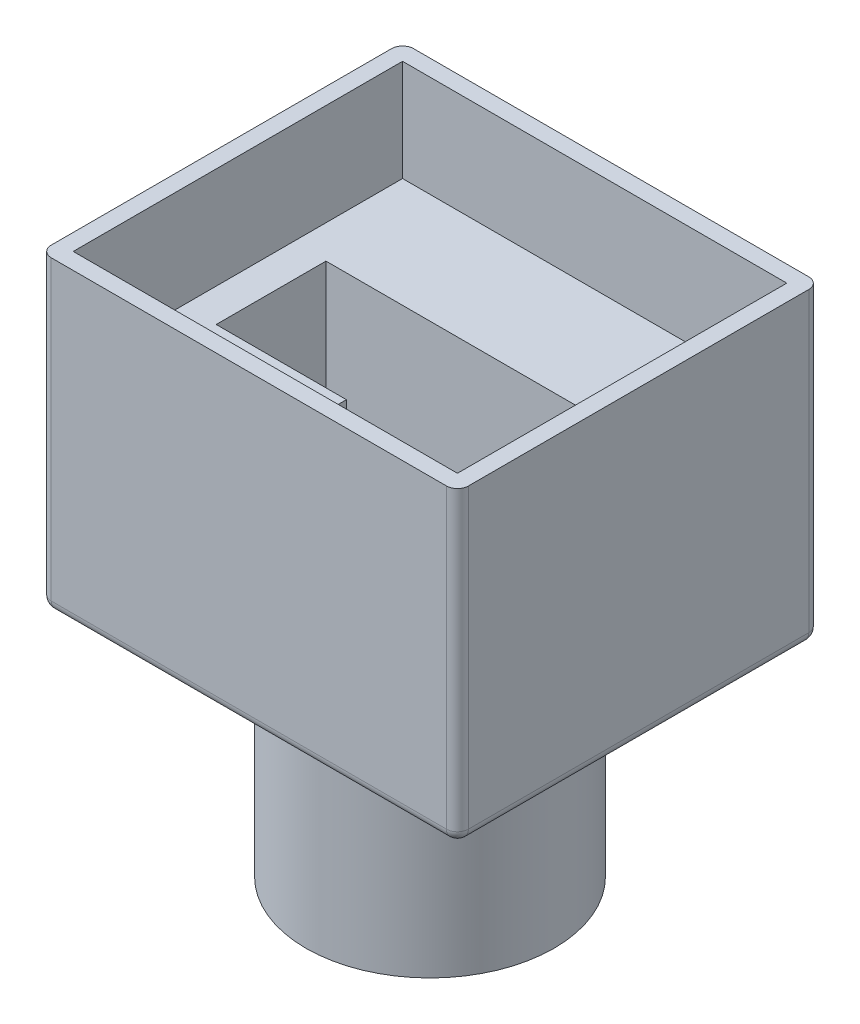
ISO-10303-21;
HEADER;
FILE_DESCRIPTION(('STEP AP214'),'2;1');
FILE_NAME('part.step','',(''),(''),'','','');
FILE_SCHEMA(('AUTOMOTIVE_DESIGN { 1 0 10303 214 1 1 1 1 }'));
ENDSEC;
DATA;
#1=APPLICATION_CONTEXT('core data for automotive mechanical design processes');
#2=APPLICATION_PROTOCOL_DEFINITION('international standard','automotive_design',2000,#1);
#3=PRODUCT_CONTEXT('',#1,'mechanical');
#4=PRODUCT('Part','Part','',(#3));
#5=PRODUCT_RELATED_PRODUCT_CATEGORY('part','',(#4));
#6=PRODUCT_DEFINITION_FORMATION('','',#4);
#7=PRODUCT_DEFINITION_CONTEXT('part definition',#1,'design');
#8=PRODUCT_DEFINITION('design','',#6,#7);
#9=PRODUCT_DEFINITION_SHAPE('','',#8);
#10=(LENGTH_UNIT() NAMED_UNIT(*) SI_UNIT(.MILLI.,.METRE.));
#11=(NAMED_UNIT(*) PLANE_ANGLE_UNIT() SI_UNIT($,.RADIAN.));
#12=(NAMED_UNIT(*) SI_UNIT($,.STERADIAN.) SOLID_ANGLE_UNIT());
#13=UNCERTAINTY_MEASURE_WITH_UNIT(LENGTH_MEASURE(1.E-05),#10,'distance_accuracy_value','');
#14=(GEOMETRIC_REPRESENTATION_CONTEXT(3) GLOBAL_UNCERTAINTY_ASSIGNED_CONTEXT((#13)) GLOBAL_UNIT_ASSIGNED_CONTEXT((#10,
#11,#12)) REPRESENTATION_CONTEXT('',''));
#15=CARTESIAN_POINT('',(0.,0.,0.));
#16=DIRECTION('',(0.,0.,1.));
#17=DIRECTION('',(1.,0.,0.));
#18=AXIS2_PLACEMENT_3D('',#15,#16,#17);
#19=CARTESIAN_POINT('',(0.,18.5,0.));
#20=DIRECTION('',(0.,-1.,0.));
#21=DIRECTION('',(0.,0.,-1.));
#22=AXIS2_PLACEMENT_3D('',#19,#20,#21);
#23=PLANE('',#22);
#24=DIRECTION('',(0.,0.,-1.));
#25=VECTOR('',#24,1.);
#26=CARTESIAN_POINT('',(38.,18.5,33.));
#27=LINE('',#26,#25);
#28=CARTESIAN_POINT('',(38.,18.5,31.));
#29=VERTEX_POINT('',#28);
#30=CARTESIAN_POINT('',(38.,18.5,-31.));
#31=VERTEX_POINT('',#30);
#32=EDGE_CURVE('E305',#29,#31,#27,.T.);
#33=ORIENTED_EDGE('',*,*,#32,.T.);
#34=CARTESIAN_POINT('',(36.,18.5,-31.));
#35=DIRECTION('',(0.,-1.,0.));
#36=DIRECTION('',(0.,0.,-1.));
#37=AXIS2_PLACEMENT_3D('',#34,#35,#36);
#38=CIRCLE('',#37,2.);
#39=CARTESIAN_POINT('',(36.,18.5,-33.));
#40=VERTEX_POINT('',#39);
#41=EDGE_CURVE('E348',#31,#40,#38,.F.);
#42=ORIENTED_EDGE('',*,*,#41,.T.);
#43=DIRECTION('',(-1.,0.,0.));
#44=VECTOR('',#43,1.);
#45=CARTESIAN_POINT('',(-38.,18.5,-33.));
#46=LINE('',#45,#44);
#47=CARTESIAN_POINT('',(-36.,18.5,-33.));
#48=VERTEX_POINT('',#47);
#49=EDGE_CURVE('E309',#40,#48,#46,.T.);
#50=ORIENTED_EDGE('',*,*,#49,.T.);
#51=CARTESIAN_POINT('',(-36.,18.5,-31.));
#52=DIRECTION('',(0.,-1.,0.));
#53=DIRECTION('',(0.,0.,-1.));
#54=AXIS2_PLACEMENT_3D('',#51,#52,#53);
#55=CIRCLE('',#54,2.);
#56=CARTESIAN_POINT('',(-38.,18.5,-31.));
#57=VERTEX_POINT('',#56);
#58=EDGE_CURVE('E345',#48,#57,#55,.F.);
#59=ORIENTED_EDGE('',*,*,#58,.T.);
#60=DIRECTION('',(0.,0.,1.));
#61=VECTOR('',#60,1.);
#62=CARTESIAN_POINT('',(-38.,18.5,33.));
#63=LINE('',#62,#61);
#64=CARTESIAN_POINT('',(-38.,18.5,31.));
#65=VERTEX_POINT('',#64);
#66=EDGE_CURVE('E313',#57,#65,#63,.T.);
#67=ORIENTED_EDGE('',*,*,#66,.T.);
#68=CARTESIAN_POINT('',(-36.,18.5,31.));
#69=DIRECTION('',(0.,-1.,0.));
#70=DIRECTION('',(0.,0.,-1.));
#71=AXIS2_PLACEMENT_3D('',#68,#69,#70);
#72=CIRCLE('',#71,2.);
#73=CARTESIAN_POINT('',(-36.,18.5,33.));
#74=VERTEX_POINT('',#73);
#75=EDGE_CURVE('E339',#65,#74,#72,.F.);
#76=ORIENTED_EDGE('',*,*,#75,.T.);
#77=DIRECTION('',(1.,0.,0.));
#78=VECTOR('',#77,1.);
#79=CARTESIAN_POINT('',(-38.,18.5,33.));
#80=LINE('',#79,#78);
#81=CARTESIAN_POINT('',(36.,18.5,33.));
#82=VERTEX_POINT('',#81);
#83=EDGE_CURVE('E317',#74,#82,#80,.T.);
#84=ORIENTED_EDGE('',*,*,#83,.T.);
#85=CARTESIAN_POINT('',(36.,18.5,31.));
#86=DIRECTION('',(0.,-1.,0.));
#87=DIRECTION('',(0.,0.,-1.));
#88=AXIS2_PLACEMENT_3D('',#85,#86,#87);
#89=CIRCLE('',#88,2.);
#90=EDGE_CURVE('E342',#82,#29,#89,.F.);
#91=ORIENTED_EDGE('',*,*,#90,.T.);
#92=EDGE_LOOP('',(#33,#42,#50,#59,#67,#76,#84,#91));
#93=FACE_BOUND('',#92,.T.);
#94=DIRECTION('',(0.,0.,-1.));
#95=VECTOR('',#94,1.);
#96=CARTESIAN_POINT('',(35.,18.5,30.));
#97=LINE('',#96,#95);
#98=CARTESIAN_POINT('',(35.,18.5,30.));
#99=VERTEX_POINT('',#98);
#100=CARTESIAN_POINT('',(35.,18.5,-30.));
#101=VERTEX_POINT('',#100);
#102=EDGE_CURVE('E264',#99,#101,#97,.T.);
#103=ORIENTED_EDGE('',*,*,#102,.F.);
#104=DIRECTION('',(1.,0.,0.));
#105=VECTOR('',#104,1.);
#106=CARTESIAN_POINT('',(-35.,18.5,30.));
#107=LINE('',#106,#105);
#108=CARTESIAN_POINT('',(-35.,18.5,30.));
#109=VERTEX_POINT('',#108);
#110=EDGE_CURVE('E275',#109,#99,#107,.T.);
#111=ORIENTED_EDGE('',*,*,#110,.F.);
#112=DIRECTION('',(0.,0.,1.));
#113=VECTOR('',#112,1.);
#114=CARTESIAN_POINT('',(-35.,18.5,30.));
#115=LINE('',#114,#113);
#116=CARTESIAN_POINT('',(-35.,18.5,-30.));
#117=VERTEX_POINT('',#116);
#118=EDGE_CURVE('E271',#117,#109,#115,.T.);
#119=ORIENTED_EDGE('',*,*,#118,.F.);
#120=DIRECTION('',(-1.,0.,0.));
#121=VECTOR('',#120,1.);
#122=CARTESIAN_POINT('',(-35.,18.5,-30.));
#123=LINE('',#122,#121);
#124=EDGE_CURVE('E267',#101,#117,#123,.T.);
#125=ORIENTED_EDGE('',*,*,#124,.F.);
#126=EDGE_LOOP('',(#103,#111,#119,#125));
#127=FACE_BOUND('',#126,.T.);
#128=ADVANCED_FACE('F43',(#93,#127),#23,.F.);
#129=CARTESIAN_POINT('',(38.,18.5,33.));
#130=DIRECTION('',(-1.,0.,0.));
#131=DIRECTION('',(0.,0.,1.));
#132=AXIS2_PLACEMENT_3D('',#129,#130,#131);
#133=PLANE('',#132);
#134=DIRECTION('',(0.,-1.,0.));
#135=VECTOR('',#134,1.);
#136=CARTESIAN_POINT('',(38.,18.5,31.));
#137=LINE('',#136,#135);
#138=CARTESIAN_POINT('',(38.,-35.65,31.));
#139=VERTEX_POINT('',#138);
#140=EDGE_CURVE('E332',#29,#139,#137,.T.);
#141=ORIENTED_EDGE('',*,*,#140,.T.);
#142=DIRECTION('',(0.,0.,1.));
#143=VECTOR('',#142,1.);
#144=CARTESIAN_POINT('',(38.,-35.65,-31.));
#145=LINE('',#144,#143);
#146=CARTESIAN_POINT('',(38.,-35.65,-31.));
#147=VERTEX_POINT('',#146);
#148=EDGE_CURVE('E391',#139,#147,#145,.F.);
#149=ORIENTED_EDGE('',*,*,#148,.T.);
#150=DIRECTION('',(0.,-1.,0.));
#151=VECTOR('',#150,1.);
#152=CARTESIAN_POINT('',(38.,18.5,-31.));
#153=LINE('',#152,#151);
#154=EDGE_CURVE('E336',#147,#31,#153,.F.);
#155=ORIENTED_EDGE('',*,*,#154,.T.);
#156=ORIENTED_EDGE('',*,*,#32,.F.);
#157=EDGE_LOOP('',(#141,#149,#155,#156));
#158=FACE_BOUND('',#157,.T.);
#159=ADVANCED_FACE('F479',(#158),#133,.F.);
#160=CARTESIAN_POINT('',(-38.,18.5,-33.));
#161=DIRECTION('',(0.,0.,1.));
#162=DIRECTION('',(1.,0.,0.));
#163=AXIS2_PLACEMENT_3D('',#160,#161,#162);
#164=PLANE('',#163);
#165=DIRECTION('',(0.,-1.,0.));
#166=VECTOR('',#165,1.);
#167=CARTESIAN_POINT('',(36.,18.5,-33.));
#168=LINE('',#167,#166);
#169=CARTESIAN_POINT('',(36.,-35.65,-33.));
#170=VERTEX_POINT('',#169);
#171=EDGE_CURVE('E328',#40,#170,#168,.T.);
#172=ORIENTED_EDGE('',*,*,#171,.T.);
#173=DIRECTION('',(1.,0.,0.));
#174=VECTOR('',#173,1.);
#175=CARTESIAN_POINT('',(-36.,-35.65,-33.));
#176=LINE('',#175,#174);
#177=CARTESIAN_POINT('',(-36.,-35.65,-33.));
#178=VERTEX_POINT('',#177);
#179=EDGE_CURVE('E53',#170,#178,#176,.F.);
#180=ORIENTED_EDGE('',*,*,#179,.T.);
#181=DIRECTION('',(0.,-1.,0.));
#182=VECTOR('',#181,1.);
#183=CARTESIAN_POINT('',(-36.,18.5,-33.));
#184=LINE('',#183,#182);
#185=EDGE_CURVE('E325',#178,#48,#184,.F.);
#186=ORIENTED_EDGE('',*,*,#185,.T.);
#187=ORIENTED_EDGE('',*,*,#49,.F.);
#188=EDGE_LOOP('',(#172,#180,#186,#187));
#189=FACE_BOUND('',#188,.T.);
#190=ADVANCED_FACE('F486',(#189),#164,.F.);
#191=CARTESIAN_POINT('',(-38.,18.5,33.));
#192=DIRECTION('',(1.,0.,0.));
#193=DIRECTION('',(0.,0.,-1.));
#194=AXIS2_PLACEMENT_3D('',#191,#192,#193);
#195=PLANE('',#194);
#196=DIRECTION('',(0.,-1.,0.));
#197=VECTOR('',#196,1.);
#198=CARTESIAN_POINT('',(-38.,18.5,-31.));
#199=LINE('',#198,#197);
#200=CARTESIAN_POINT('',(-38.,-35.65,-31.));
#201=VERTEX_POINT('',#200);
#202=EDGE_CURVE('E354',#57,#201,#199,.T.);
#203=ORIENTED_EDGE('',*,*,#202,.T.);
#204=DIRECTION('',(0.,0.,-1.));
#205=VECTOR('',#204,1.);
#206=CARTESIAN_POINT('',(-38.,-35.65,31.));
#207=LINE('',#206,#205);
#208=CARTESIAN_POINT('',(-38.,-35.65,31.));
#209=VERTEX_POINT('',#208);
#210=EDGE_CURVE('E11',#201,#209,#207,.F.);
#211=ORIENTED_EDGE('',*,*,#210,.T.);
#212=DIRECTION('',(0.,-1.,0.));
#213=VECTOR('',#212,1.);
#214=CARTESIAN_POINT('',(-38.,18.5,31.));
#215=LINE('',#214,#213);
#216=EDGE_CURVE('E351',#209,#65,#215,.F.);
#217=ORIENTED_EDGE('',*,*,#216,.T.);
#218=ORIENTED_EDGE('',*,*,#66,.F.);
#219=EDGE_LOOP('',(#203,#211,#217,#218));
#220=FACE_BOUND('',#219,.T.);
#221=ADVANCED_FACE('F497',(#220),#195,.F.);
#222=CARTESIAN_POINT('',(-38.,18.5,33.));
#223=DIRECTION('',(0.,0.,-1.));
#224=DIRECTION('',(-1.,0.,0.));
#225=AXIS2_PLACEMENT_3D('',#222,#223,#224);
#226=PLANE('',#225);
#227=DIRECTION('',(0.,-1.,0.));
#228=VECTOR('',#227,1.);
#229=CARTESIAN_POINT('',(-36.,18.5,33.));
#230=LINE('',#229,#228);
#231=CARTESIAN_POINT('',(-36.,-35.65,33.));
#232=VERTEX_POINT('',#231);
#233=EDGE_CURVE('E358',#74,#232,#230,.T.);
#234=ORIENTED_EDGE('',*,*,#233,.T.);
#235=DIRECTION('',(-1.,0.,0.));
#236=VECTOR('',#235,1.);
#237=CARTESIAN_POINT('',(36.,-35.65,33.));
#238=LINE('',#237,#236);
#239=CARTESIAN_POINT('',(36.,-35.65,33.));
#240=VERTEX_POINT('',#239);
#241=EDGE_CURVE('E388',#232,#240,#238,.F.);
#242=ORIENTED_EDGE('',*,*,#241,.T.);
#243=DIRECTION('',(0.,-1.,0.));
#244=VECTOR('',#243,1.);
#245=CARTESIAN_POINT('',(36.,18.5,33.));
#246=LINE('',#245,#244);
#247=EDGE_CURVE('E362',#240,#82,#246,.F.);
#248=ORIENTED_EDGE('',*,*,#247,.T.);
#249=ORIENTED_EDGE('',*,*,#83,.F.);
#250=EDGE_LOOP('',(#234,#242,#248,#249));
#251=FACE_BOUND('',#250,.T.);
#252=ADVANCED_FACE('F494',(#251),#226,.F.);
#253=CARTESIAN_POINT('',(35.,18.5,30.));
#254=DIRECTION('',(-1.,0.,0.));
#255=DIRECTION('',(0.,0.,1.));
#256=AXIS2_PLACEMENT_3D('',#253,#254,#255);
#257=PLANE('',#256);
#258=DIRECTION('',(0.,0.,-1.));
#259=VECTOR('',#258,1.);
#260=CARTESIAN_POINT('',(35.,0.,30.));
#261=LINE('',#260,#259);
#262=CARTESIAN_POINT('',(35.,0.,-4.99999999999999));
#263=VERTEX_POINT('',#262);
#264=CARTESIAN_POINT('',(35.,0.,-30.));
#265=VERTEX_POINT('',#264);
#266=EDGE_CURVE('E263',#263,#265,#261,.T.);
#267=ORIENTED_EDGE('',*,*,#266,.F.);
#268=DIRECTION('',(0.,1.,0.));
#269=VECTOR('',#268,1.);
#270=CARTESIAN_POINT('',(35.,-27.65,-5.));
#271=LINE('',#270,#269);
#272=CARTESIAN_POINT('',(35.,-27.65,-5.));
#273=VERTEX_POINT('',#272);
#274=EDGE_CURVE('E257',#273,#263,#271,.T.);
#275=ORIENTED_EDGE('',*,*,#274,.F.);
#276=DIRECTION('',(0.,0.,-1.));
#277=VECTOR('',#276,1.);
#278=CARTESIAN_POINT('',(35.,-27.65,0.));
#279=LINE('',#278,#277);
#280=CARTESIAN_POINT('',(35.,-27.65,30.));
#281=VERTEX_POINT('',#280);
#282=EDGE_CURVE('E443',#281,#273,#279,.T.);
#283=ORIENTED_EDGE('',*,*,#282,.F.);
#284=DIRECTION('',(0.,-1.,0.));
#285=VECTOR('',#284,1.);
#286=CARTESIAN_POINT('',(35.,18.5,30.));
#287=LINE('',#286,#285);
#288=EDGE_CURVE('E278',#99,#281,#287,.T.);
#289=ORIENTED_EDGE('',*,*,#288,.F.);
#290=ORIENTED_EDGE('',*,*,#102,.T.);
#291=DIRECTION('',(0.,-1.,0.));
#292=VECTOR('',#291,1.);
#293=CARTESIAN_POINT('',(35.,18.5,-30.));
#294=LINE('',#293,#292);
#295=EDGE_CURVE('E301',#101,#265,#294,.T.);
#296=ORIENTED_EDGE('',*,*,#295,.T.);
#297=EDGE_LOOP('',(#267,#275,#283,#289,#290,#296));
#298=FACE_BOUND('',#297,.T.);
#299=ADVANCED_FACE('F492',(#298),#257,.T.);
#300=CARTESIAN_POINT('',(-35.,18.5,-30.));
#301=DIRECTION('',(0.,0.,1.));
#302=DIRECTION('',(1.,0.,0.));
#303=AXIS2_PLACEMENT_3D('',#300,#301,#302);
#304=PLANE('',#303);
#305=DIRECTION('',(-1.,0.,0.));
#306=VECTOR('',#305,1.);
#307=CARTESIAN_POINT('',(-35.,0.,-30.));
#308=LINE('',#307,#306);
#309=CARTESIAN_POINT('',(-35.,0.,-30.));
#310=VERTEX_POINT('',#309);
#311=EDGE_CURVE('E282',#265,#310,#308,.T.);
#312=ORIENTED_EDGE('',*,*,#311,.F.);
#313=ORIENTED_EDGE('',*,*,#295,.F.);
#314=ORIENTED_EDGE('',*,*,#124,.T.);
#315=DIRECTION('',(0.,-1.,0.));
#316=VECTOR('',#315,1.);
#317=CARTESIAN_POINT('',(-35.,18.5,-30.));
#318=LINE('',#317,#316);
#319=EDGE_CURVE('E298',#117,#310,#318,.T.);
#320=ORIENTED_EDGE('',*,*,#319,.T.);
#321=EDGE_LOOP('',(#312,#313,#314,#320));
#322=FACE_BOUND('',#321,.T.);
#323=ADVANCED_FACE('F618',(#322),#304,.T.);
#324=CARTESIAN_POINT('',(-35.,18.5,30.));
#325=DIRECTION('',(1.,0.,0.));
#326=DIRECTION('',(0.,0.,-1.));
#327=AXIS2_PLACEMENT_3D('',#324,#325,#326);
#328=PLANE('',#327);
#329=DIRECTION('',(0.,0.,1.));
#330=VECTOR('',#329,1.);
#331=CARTESIAN_POINT('',(-35.,0.,30.));
#332=LINE('',#331,#330);
#333=CARTESIAN_POINT('',(-35.,0.,30.));
#334=VERTEX_POINT('',#333);
#335=EDGE_CURVE('E286',#310,#334,#332,.T.);
#336=ORIENTED_EDGE('',*,*,#335,.F.);
#337=ORIENTED_EDGE('',*,*,#319,.F.);
#338=ORIENTED_EDGE('',*,*,#118,.T.);
#339=DIRECTION('',(0.,-1.,0.));
#340=VECTOR('',#339,1.);
#341=CARTESIAN_POINT('',(-35.,18.5,30.));
#342=LINE('',#341,#340);
#343=EDGE_CURVE('E294',#109,#334,#342,.T.);
#344=ORIENTED_EDGE('',*,*,#343,.T.);
#345=EDGE_LOOP('',(#336,#337,#338,#344));
#346=FACE_BOUND('',#345,.T.);
#347=ADVANCED_FACE('F612',(#346),#328,.T.);
#348=CARTESIAN_POINT('',(-35.,18.5,30.));
#349=DIRECTION('',(0.,0.,-1.));
#350=DIRECTION('',(-1.,0.,0.));
#351=AXIS2_PLACEMENT_3D('',#348,#349,#350);
#352=PLANE('',#351);
#353=DIRECTION('',(1.,0.,0.));
#354=VECTOR('',#353,1.);
#355=CARTESIAN_POINT('',(-35.,0.,30.));
#356=LINE('',#355,#354);
#357=CARTESIAN_POINT('',(-5.225,0.,30.));
#358=VERTEX_POINT('',#357);
#359=EDGE_CURVE('E268',#334,#358,#356,.T.);
#360=ORIENTED_EDGE('',*,*,#359,.F.);
#361=ORIENTED_EDGE('',*,*,#343,.F.);
#362=ORIENTED_EDGE('',*,*,#110,.T.);
#363=ORIENTED_EDGE('',*,*,#288,.T.);
#364=DIRECTION('',(1.,0.,0.));
#365=VECTOR('',#364,1.);
#366=CARTESIAN_POINT('',(0.,-27.65,30.));
#367=LINE('',#366,#365);
#368=CARTESIAN_POINT('',(-5.225,-27.65,30.));
#369=VERTEX_POINT('',#368);
#370=EDGE_CURVE('E201',#369,#281,#367,.T.);
#371=ORIENTED_EDGE('',*,*,#370,.F.);
#372=DIRECTION('',(0.,1.,0.));
#373=VECTOR('',#372,1.);
#374=CARTESIAN_POINT('',(-5.225,-27.65,30.));
#375=LINE('',#374,#373);
#376=EDGE_CURVE('E196',#369,#358,#375,.T.);
#377=ORIENTED_EDGE('',*,*,#376,.T.);
#378=EDGE_LOOP('',(#360,#361,#362,#363,#371,#377));
#379=FACE_BOUND('',#378,.T.);
#380=ADVANCED_FACE('F605',(#379),#352,.T.);
#381=CARTESIAN_POINT('',(0.,0.,0.));
#382=DIRECTION('',(0.,-1.,0.));
#383=DIRECTION('',(0.,0.,-1.));
#384=AXIS2_PLACEMENT_3D('',#381,#382,#383);
#385=PLANE('',#384);
#386=ORIENTED_EDGE('',*,*,#335,.T.);
#387=ORIENTED_EDGE('',*,*,#359,.T.);
#388=DIRECTION('',(0.,0.,1.));
#389=VECTOR('',#388,1.);
#390=CARTESIAN_POINT('',(-5.225,0.,0.));
#391=LINE('',#390,#389);
#392=CARTESIAN_POINT('',(-5.225,0.,9.99999999999999));
#393=VERTEX_POINT('',#392);
#394=EDGE_CURVE('E224',#393,#358,#391,.T.);
#395=ORIENTED_EDGE('',*,*,#394,.F.);
#396=DIRECTION('',(1.,0.,0.));
#397=VECTOR('',#396,1.);
#398=CARTESIAN_POINT('',(0.,0.,9.99999999999999));
#399=LINE('',#398,#397);
#400=CARTESIAN_POINT('',(-28.95,0.,9.99999999999999));
#401=VERTEX_POINT('',#400);
#402=EDGE_CURVE('E202',#401,#393,#399,.T.);
#403=ORIENTED_EDGE('',*,*,#402,.F.);
#404=DIRECTION('',(0.,0.,-1.));
#405=VECTOR('',#404,1.);
#406=CARTESIAN_POINT('',(-28.95,0.,0.));
#407=LINE('',#406,#405);
#408=CARTESIAN_POINT('',(-28.95,0.,-10.));
#409=VERTEX_POINT('',#408);
#410=EDGE_CURVE('E240',#401,#409,#407,.T.);
#411=ORIENTED_EDGE('',*,*,#410,.T.);
#412=DIRECTION('',(1.,0.,0.));
#413=VECTOR('',#412,1.);
#414=CARTESIAN_POINT('',(0.,0.,-10.));
#415=LINE('',#414,#413);
#416=CARTESIAN_POINT('',(18.5,0.,-10.));
#417=VERTEX_POINT('',#416);
#418=EDGE_CURVE('E236',#409,#417,#415,.T.);
#419=ORIENTED_EDGE('',*,*,#418,.T.);
#420=DIRECTION('',(0.,0.,-1.));
#421=VECTOR('',#420,1.);
#422=CARTESIAN_POINT('',(18.5,0.,0.));
#423=LINE('',#422,#421);
#424=CARTESIAN_POINT('',(18.5,0.,-5.));
#425=VERTEX_POINT('',#424);
#426=EDGE_CURVE('E232',#425,#417,#423,.T.);
#427=ORIENTED_EDGE('',*,*,#426,.F.);
#428=DIRECTION('',(1.,0.,0.));
#429=VECTOR('',#428,1.);
#430=CARTESIAN_POINT('',(0.,0.,-5.00000000000001));
#431=LINE('',#430,#429);
#432=EDGE_CURVE('E227',#425,#263,#431,.T.);
#433=ORIENTED_EDGE('',*,*,#432,.T.);
#434=ORIENTED_EDGE('',*,*,#266,.T.);
#435=ORIENTED_EDGE('',*,*,#311,.T.);
#436=EDGE_LOOP('',(#386,#387,#395,#403,#411,#419,#427,#433,#434,#435));
#437=FACE_BOUND('',#436,.T.);
#438=ADVANCED_FACE('F466',(#437),#385,.F.);
#439=CARTESIAN_POINT('',(-5.225,-27.65,0.));
#440=DIRECTION('',(-1.,0.,0.));
#441=DIRECTION('',(0.,0.,1.));
#442=AXIS2_PLACEMENT_3D('',#439,#440,#441);
#443=PLANE('',#442);
#444=ORIENTED_EDGE('',*,*,#394,.T.);
#445=ORIENTED_EDGE('',*,*,#376,.F.);
#446=DIRECTION('',(0.,0.,1.));
#447=VECTOR('',#446,1.);
#448=CARTESIAN_POINT('',(-5.225,-27.65,0.));
#449=LINE('',#448,#447);
#450=CARTESIAN_POINT('',(-5.225,-27.65,9.99999999999999));
#451=VERTEX_POINT('',#450);
#452=EDGE_CURVE('E189',#451,#369,#449,.T.);
#453=ORIENTED_EDGE('',*,*,#452,.F.);
#454=DIRECTION('',(0.,1.,0.));
#455=VECTOR('',#454,1.);
#456=CARTESIAN_POINT('',(-5.225,-27.65,9.99999999999999));
#457=LINE('',#456,#455);
#458=EDGE_CURVE('E193',#451,#393,#457,.T.);
#459=ORIENTED_EDGE('',*,*,#458,.T.);
#460=EDGE_LOOP('',(#444,#445,#453,#459));
#461=FACE_BOUND('',#460,.T.);
#462=ADVANCED_FACE('F192',(#461),#443,.F.);
#463=CARTESIAN_POINT('',(0.,-27.65,-5.00000000000001));
#464=DIRECTION('',(0.,0.,1.));
#465=DIRECTION('',(1.,0.,0.));
#466=AXIS2_PLACEMENT_3D('',#463,#464,#465);
#467=PLANE('',#466);
#468=ORIENTED_EDGE('',*,*,#432,.F.);
#469=DIRECTION('',(0.,1.,0.));
#470=VECTOR('',#469,1.);
#471=CARTESIAN_POINT('',(18.5,-27.65,-5.));
#472=LINE('',#471,#470);
#473=CARTESIAN_POINT('',(18.5,-27.65,-5.));
#474=VERTEX_POINT('',#473);
#475=EDGE_CURVE('E254',#474,#425,#472,.T.);
#476=ORIENTED_EDGE('',*,*,#475,.F.);
#477=DIRECTION('',(1.,0.,0.));
#478=VECTOR('',#477,1.);
#479=CARTESIAN_POINT('',(0.,-27.65,-5.00000000000001));
#480=LINE('',#479,#478);
#481=EDGE_CURVE('E447',#474,#273,#480,.T.);
#482=ORIENTED_EDGE('',*,*,#481,.T.);
#483=ORIENTED_EDGE('',*,*,#274,.T.);
#484=EDGE_LOOP('',(#468,#476,#482,#483));
#485=FACE_BOUND('',#484,.T.);
#486=ADVANCED_FACE('F610',(#485),#467,.T.);
#487=CARTESIAN_POINT('',(18.5,-27.65,0.));
#488=DIRECTION('',(1.,0.,0.));
#489=DIRECTION('',(0.,0.,-1.));
#490=AXIS2_PLACEMENT_3D('',#487,#488,#489);
#491=PLANE('',#490);
#492=ORIENTED_EDGE('',*,*,#426,.T.);
#493=DIRECTION('',(0.,1.,0.));
#494=VECTOR('',#493,1.);
#495=CARTESIAN_POINT('',(18.5,-27.65,-10.));
#496=LINE('',#495,#494);
#497=CARTESIAN_POINT('',(18.5,-27.65,-10.));
#498=VERTEX_POINT('',#497);
#499=EDGE_CURVE('E251',#498,#417,#496,.T.);
#500=ORIENTED_EDGE('',*,*,#499,.F.);
#501=DIRECTION('',(0.,0.,-1.));
#502=VECTOR('',#501,1.);
#503=CARTESIAN_POINT('',(18.5,-27.65,0.));
#504=LINE('',#503,#502);
#505=EDGE_CURVE('E451',#474,#498,#504,.T.);
#506=ORIENTED_EDGE('',*,*,#505,.F.);
#507=ORIENTED_EDGE('',*,*,#475,.T.);
#508=EDGE_LOOP('',(#492,#500,#506,#507));
#509=FACE_BOUND('',#508,.T.);
#510=ADVANCED_FACE('F462',(#509),#491,.F.);
#511=CARTESIAN_POINT('',(0.,-27.65,-10.));
#512=DIRECTION('',(0.,0.,1.));
#513=DIRECTION('',(1.,0.,0.));
#514=AXIS2_PLACEMENT_3D('',#511,#512,#513);
#515=PLANE('',#514);
#516=ORIENTED_EDGE('',*,*,#418,.F.);
#517=DIRECTION('',(0.,1.,0.));
#518=VECTOR('',#517,1.);
#519=CARTESIAN_POINT('',(-28.95,-27.65,-10.));
#520=LINE('',#519,#518);
#521=CARTESIAN_POINT('',(-28.95,-27.65,-10.));
#522=VERTEX_POINT('',#521);
#523=EDGE_CURVE('E248',#522,#409,#520,.T.);
#524=ORIENTED_EDGE('',*,*,#523,.F.);
#525=DIRECTION('',(1.,0.,0.));
#526=VECTOR('',#525,1.);
#527=CARTESIAN_POINT('',(0.,-27.65,-10.));
#528=LINE('',#527,#526);
#529=EDGE_CURVE('E220',#522,#498,#528,.T.);
#530=ORIENTED_EDGE('',*,*,#529,.T.);
#531=ORIENTED_EDGE('',*,*,#499,.T.);
#532=EDGE_LOOP('',(#516,#524,#530,#531));
#533=FACE_BOUND('',#532,.T.);
#534=ADVANCED_FACE('F458',(#533),#515,.T.);
#535=CARTESIAN_POINT('',(-28.95,-27.65,0.));
#536=DIRECTION('',(1.,0.,0.));
#537=DIRECTION('',(0.,0.,-1.));
#538=AXIS2_PLACEMENT_3D('',#535,#536,#537);
#539=PLANE('',#538);
#540=ORIENTED_EDGE('',*,*,#410,.F.);
#541=DIRECTION('',(0.,1.,0.));
#542=VECTOR('',#541,1.);
#543=CARTESIAN_POINT('',(-28.95,-27.65,9.99999999999999));
#544=LINE('',#543,#542);
#545=CARTESIAN_POINT('',(-28.95,-27.65,9.99999999999999));
#546=VERTEX_POINT('',#545);
#547=EDGE_CURVE('E211',#546,#401,#544,.T.);
#548=ORIENTED_EDGE('',*,*,#547,.F.);
#549=DIRECTION('',(0.,0.,-1.));
#550=VECTOR('',#549,1.);
#551=CARTESIAN_POINT('',(-28.95,-27.65,0.));
#552=LINE('',#551,#550);
#553=EDGE_CURVE('E216',#546,#522,#552,.T.);
#554=ORIENTED_EDGE('',*,*,#553,.T.);
#555=ORIENTED_EDGE('',*,*,#523,.T.);
#556=EDGE_LOOP('',(#540,#548,#554,#555));
#557=FACE_BOUND('',#556,.T.);
#558=ADVANCED_FACE('F469',(#557),#539,.T.);
#559=CARTESIAN_POINT('',(0.,-27.65,9.99999999999999));
#560=DIRECTION('',(0.,0.,1.));
#561=DIRECTION('',(1.,0.,0.));
#562=AXIS2_PLACEMENT_3D('',#559,#560,#561);
#563=PLANE('',#562);
#564=ORIENTED_EDGE('',*,*,#402,.T.);
#565=ORIENTED_EDGE('',*,*,#458,.F.);
#566=DIRECTION('',(1.,0.,0.));
#567=VECTOR('',#566,1.);
#568=CARTESIAN_POINT('',(0.,-27.65,9.99999999999999));
#569=LINE('',#568,#567);
#570=EDGE_CURVE('E207',#546,#451,#569,.T.);
#571=ORIENTED_EDGE('',*,*,#570,.F.);
#572=ORIENTED_EDGE('',*,*,#547,.T.);
#573=EDGE_LOOP('',(#564,#565,#571,#572));
#574=FACE_BOUND('',#573,.T.);
#575=ADVANCED_FACE('F206',(#574),#563,.F.);
#576=CARTESIAN_POINT('',(0.,-27.65,0.));
#577=DIRECTION('',(0.,-1.,0.));
#578=DIRECTION('',(0.,0.,-1.));
#579=AXIS2_PLACEMENT_3D('',#576,#577,#578);
#580=PLANE('',#579);
#581=ORIENTED_EDGE('',*,*,#570,.T.);
#582=ORIENTED_EDGE('',*,*,#452,.T.);
#583=ORIENTED_EDGE('',*,*,#370,.T.);
#584=ORIENTED_EDGE('',*,*,#282,.T.);
#585=ORIENTED_EDGE('',*,*,#481,.F.);
#586=ORIENTED_EDGE('',*,*,#505,.T.);
#587=ORIENTED_EDGE('',*,*,#529,.F.);
#588=ORIENTED_EDGE('',*,*,#553,.F.);
#589=EDGE_LOOP('',(#581,#582,#583,#584,#585,#586,#587,#588));
#590=FACE_BOUND('',#589,.T.);
#591=ADVANCED_FACE('F213',(#590),#580,.F.);
#592=CARTESIAN_POINT('',(0.,-37.65,0.));
#593=DIRECTION('',(0.,-1.,0.));
#594=DIRECTION('',(0.,0.,-1.));
#595=AXIS2_PLACEMENT_3D('',#592,#593,#594);
#596=PLANE('',#595);
#597=DIRECTION('',(0.,0.,1.));
#598=VECTOR('',#597,1.);
#599=CARTESIAN_POINT('',(36.,-37.65,31.));
#600=LINE('',#599,#598);
#601=CARTESIAN_POINT('',(36.,-37.65,-31.));
#602=VERTEX_POINT('',#601);
#603=CARTESIAN_POINT('',(36.,-37.65,31.));
#604=VERTEX_POINT('',#603);
#605=EDGE_CURVE('E61',#602,#604,#600,.T.);
#606=ORIENTED_EDGE('',*,*,#605,.T.);
#607=DIRECTION('',(-1.,0.,0.));
#608=VECTOR('',#607,1.);
#609=CARTESIAN_POINT('',(-36.,-37.65,31.));
#610=LINE('',#609,#608);
#611=CARTESIAN_POINT('',(-36.,-37.65,31.));
#612=VERTEX_POINT('',#611);
#613=EDGE_CURVE('E385',#604,#612,#610,.T.);
#614=ORIENTED_EDGE('',*,*,#613,.T.);
#615=DIRECTION('',(0.,0.,-1.));
#616=VECTOR('',#615,1.);
#617=CARTESIAN_POINT('',(-36.,-37.65,-31.));
#618=LINE('',#617,#616);
#619=CARTESIAN_POINT('',(-36.,-37.65,-31.));
#620=VERTEX_POINT('',#619);
#621=EDGE_CURVE('E378',#612,#620,#618,.T.);
#622=ORIENTED_EDGE('',*,*,#621,.T.);
#623=DIRECTION('',(1.,0.,0.));
#624=VECTOR('',#623,1.);
#625=CARTESIAN_POINT('',(36.,-37.65,-31.));
#626=LINE('',#625,#624);
#627=EDGE_CURVE('E66',#620,#602,#626,.T.);
#628=ORIENTED_EDGE('',*,*,#627,.T.);
#629=EDGE_LOOP('',(#606,#614,#622,#628));
#630=FACE_BOUND('',#629,.T.);
#631=CARTESIAN_POINT('',(0.,-37.65,0.));
#632=DIRECTION('',(0.,-1.,0.));
#633=DIRECTION('',(0.,0.,-1.));
#634=AXIS2_PLACEMENT_3D('',#631,#632,#633);
#635=CIRCLE('',#634,22.6);
#636=CARTESIAN_POINT('',(0.,-37.65,-22.6));
#637=VERTEX_POINT('',#636);
#638=EDGE_CURVE('E430',#637,#637,#635,.T.);
#639=ORIENTED_EDGE('',*,*,#638,.F.);
#640=EDGE_LOOP('',(#639));
#641=FACE_BOUND('',#640,.T.);
#642=ADVANCED_FACE('F572',(#630,#641),#596,.T.);
#643=CARTESIAN_POINT('',(0.,-77.65,0.));
#644=DIRECTION('',(0.,-1.,0.));
#645=DIRECTION('',(0.,0.,-1.));
#646=AXIS2_PLACEMENT_3D('',#643,#644,#645);
#647=PLANE('',#646);
#648=CARTESIAN_POINT('',(0.,-77.65,0.));
#649=DIRECTION('',(0.,-1.,0.));
#650=DIRECTION('',(0.,0.,-1.));
#651=AXIS2_PLACEMENT_3D('',#648,#649,#650);
#652=CIRCLE('',#651,22.6);
#653=CARTESIAN_POINT('',(0.,-77.65,-22.6));
#654=VERTEX_POINT('',#653);
#655=EDGE_CURVE('E228',#654,#654,#652,.T.);
#656=ORIENTED_EDGE('',*,*,#655,.T.);
#657=EDGE_LOOP('',(#656));
#658=FACE_BOUND('',#657,.T.);
#659=CARTESIAN_POINT('',(0.,-77.65,0.));
#660=DIRECTION('',(0.,-1.,0.));
#661=DIRECTION('',(0.,0.,-1.));
#662=AXIS2_PLACEMENT_3D('',#659,#660,#661);
#663=CIRCLE('',#662,19.6);
#664=CARTESIAN_POINT('',(0.,-77.65,-19.6));
#665=VERTEX_POINT('',#664);
#666=EDGE_CURVE('E425',#665,#665,#663,.T.);
#667=ORIENTED_EDGE('',*,*,#666,.F.);
#668=EDGE_LOOP('',(#667));
#669=FACE_BOUND('',#668,.T.);
#670=ADVANCED_FACE('F584',(#658,#669),#647,.T.);
#671=CARTESIAN_POINT('',(0.,-77.65,0.));
#672=DIRECTION('',(0.,1.,0.));
#673=DIRECTION('',(0.,0.,1.));
#674=AXIS2_PLACEMENT_3D('',#671,#672,#673);
#675=CYLINDRICAL_SURFACE('',#674,22.6);
#676=ORIENTED_EDGE('',*,*,#655,.F.);
#677=EDGE_LOOP('',(#676));
#678=FACE_BOUND('',#677,.T.);
#679=ORIENTED_EDGE('',*,*,#638,.T.);
#680=EDGE_LOOP('',(#679));
#681=FACE_BOUND('',#680,.T.);
#682=ADVANCED_FACE('F588',(#678,#681),#675,.T.);
#683=CARTESIAN_POINT('',(0.,-77.65,0.));
#684=DIRECTION('',(0.,1.,0.));
#685=DIRECTION('',(0.,0.,1.));
#686=AXIS2_PLACEMENT_3D('',#683,#684,#685);
#687=CYLINDRICAL_SURFACE('',#686,19.6);
#688=ORIENTED_EDGE('',*,*,#666,.T.);
#689=EDGE_LOOP('',(#688));
#690=FACE_BOUND('',#689,.T.);
#691=CARTESIAN_POINT('',(0.,-37.65,0.));
#692=DIRECTION('',(0.,-1.,0.));
#693=DIRECTION('',(0.,0.,-1.));
#694=AXIS2_PLACEMENT_3D('',#691,#692,#693);
#695=CIRCLE('',#694,19.6);
#696=CARTESIAN_POINT('',(0.,-37.65,-19.6));
#697=VERTEX_POINT('',#696);
#698=EDGE_CURVE('E321',#697,#697,#695,.F.);
#699=ORIENTED_EDGE('',*,*,#698,.T.);
#700=EDGE_LOOP('',(#699));
#701=FACE_BOUND('',#700,.T.);
#702=ADVANCED_FACE('F590',(#690,#701),#687,.F.);
#703=ORIENTED_EDGE('',*,*,#698,.F.);
#704=EDGE_LOOP('',(#703));
#705=FACE_BOUND('',#704,.T.);
#706=ADVANCED_FACE('F509',(#705),#596,.T.);
#707=CARTESIAN_POINT('',(36.,18.5,-31.));
#708=DIRECTION('',(0.,-1.,0.));
#709=DIRECTION('',(0.,0.,-1.));
#710=AXIS2_PLACEMENT_3D('',#707,#708,#709);
#711=CYLINDRICAL_SURFACE('',#710,2.);
#712=ORIENTED_EDGE('',*,*,#154,.F.);
#713=CARTESIAN_POINT('',(36.,-35.65,-31.));
#714=DIRECTION('',(0.,-1.,0.));
#715=DIRECTION('',(0.,0.,-1.));
#716=AXIS2_PLACEMENT_3D('',#713,#714,#715);
#717=CIRCLE('',#716,2.);
#718=EDGE_CURVE('E372',#147,#170,#717,.F.);
#719=ORIENTED_EDGE('',*,*,#718,.T.);
#720=ORIENTED_EDGE('',*,*,#171,.F.);
#721=ORIENTED_EDGE('',*,*,#41,.F.);
#722=EDGE_LOOP('',(#712,#719,#720,#721));
#723=FACE_BOUND('',#722,.T.);
#724=ADVANCED_FACE('F505',(#723),#711,.T.);
#725=CARTESIAN_POINT('',(-36.,18.5,-31.));
#726=DIRECTION('',(0.,-1.,0.));
#727=DIRECTION('',(0.,0.,-1.));
#728=AXIS2_PLACEMENT_3D('',#725,#726,#727);
#729=CYLINDRICAL_SURFACE('',#728,2.);
#730=ORIENTED_EDGE('',*,*,#185,.F.);
#731=CARTESIAN_POINT('',(-36.,-35.65,-31.));
#732=DIRECTION('',(0.,-1.,0.));
#733=DIRECTION('',(0.,0.,-1.));
#734=AXIS2_PLACEMENT_3D('',#731,#732,#733);
#735=CIRCLE('',#734,2.);
#736=EDGE_CURVE('E375',#178,#201,#735,.F.);
#737=ORIENTED_EDGE('',*,*,#736,.T.);
#738=ORIENTED_EDGE('',*,*,#202,.F.);
#739=ORIENTED_EDGE('',*,*,#58,.F.);
#740=EDGE_LOOP('',(#730,#737,#738,#739));
#741=FACE_BOUND('',#740,.T.);
#742=ADVANCED_FACE('F508',(#741),#729,.T.);
#743=CARTESIAN_POINT('',(36.,18.5,31.));
#744=DIRECTION('',(0.,-1.,0.));
#745=DIRECTION('',(0.,0.,-1.));
#746=AXIS2_PLACEMENT_3D('',#743,#744,#745);
#747=CYLINDRICAL_SURFACE('',#746,2.);
#748=ORIENTED_EDGE('',*,*,#247,.F.);
#749=CARTESIAN_POINT('',(36.,-35.65,31.));
#750=DIRECTION('',(0.,-1.,0.));
#751=DIRECTION('',(0.,0.,-1.));
#752=AXIS2_PLACEMENT_3D('',#749,#750,#751);
#753=CIRCLE('',#752,2.);
#754=EDGE_CURVE('E369',#240,#139,#753,.F.);
#755=ORIENTED_EDGE('',*,*,#754,.T.);
#756=ORIENTED_EDGE('',*,*,#140,.F.);
#757=ORIENTED_EDGE('',*,*,#90,.F.);
#758=EDGE_LOOP('',(#748,#755,#756,#757));
#759=FACE_BOUND('',#758,.T.);
#760=ADVANCED_FACE('F513',(#759),#747,.T.);
#761=CARTESIAN_POINT('',(-36.,18.5,31.));
#762=DIRECTION('',(0.,-1.,0.));
#763=DIRECTION('',(0.,0.,-1.));
#764=AXIS2_PLACEMENT_3D('',#761,#762,#763);
#765=CYLINDRICAL_SURFACE('',#764,2.);
#766=ORIENTED_EDGE('',*,*,#216,.F.);
#767=CARTESIAN_POINT('',(-36.,-35.65,31.));
#768=DIRECTION('',(0.,-1.,0.));
#769=DIRECTION('',(0.,0.,-1.));
#770=AXIS2_PLACEMENT_3D('',#767,#768,#769);
#771=CIRCLE('',#770,2.);
#772=EDGE_CURVE('E365',#209,#232,#771,.F.);
#773=ORIENTED_EDGE('',*,*,#772,.T.);
#774=ORIENTED_EDGE('',*,*,#233,.F.);
#775=ORIENTED_EDGE('',*,*,#75,.F.);
#776=EDGE_LOOP('',(#766,#773,#774,#775));
#777=FACE_BOUND('',#776,.T.);
#778=ADVANCED_FACE('F517',(#777),#765,.T.);
#779=CARTESIAN_POINT('',(36.,-35.65,-31.));
#780=DIRECTION('',(0.,-1.,0.));
#781=DIRECTION('',(0.,0.,-1.));
#782=AXIS2_PLACEMENT_3D('',#779,#780,#781);
#783=SPHERICAL_SURFACE('',#782,2.);
#784=CARTESIAN_POINT('',(36.,-35.65,-31.));
#785=DIRECTION('',(-1.,0.,0.));
#786=DIRECTION('',(0.,0.,1.));
#787=AXIS2_PLACEMENT_3D('',#784,#785,#786);
#788=CIRCLE('',#787,2.);
#789=EDGE_CURVE('E417',#170,#602,#788,.T.);
#790=ORIENTED_EDGE('',*,*,#789,.F.);
#791=ORIENTED_EDGE('',*,*,#718,.F.);
#792=CARTESIAN_POINT('',(36.,-35.65,-31.));
#793=DIRECTION('',(0.,0.,1.));
#794=DIRECTION('',(1.,0.,0.));
#795=AXIS2_PLACEMENT_3D('',#792,#793,#794);
#796=CIRCLE('',#795,2.);
#797=EDGE_CURVE('E47',#602,#147,#796,.T.);
#798=ORIENTED_EDGE('',*,*,#797,.F.);
#799=EDGE_LOOP('',(#790,#791,#798));
#800=FACE_BOUND('',#799,.T.);
#801=ADVANCED_FACE('F45',(#800),#783,.T.);
#802=CARTESIAN_POINT('',(36.,-35.65,0.));
#803=DIRECTION('',(0.,0.,-1.));
#804=DIRECTION('',(-1.,0.,0.));
#805=AXIS2_PLACEMENT_3D('',#802,#803,#804);
#806=CYLINDRICAL_SURFACE('',#805,2.);
#807=ORIENTED_EDGE('',*,*,#797,.T.);
#808=ORIENTED_EDGE('',*,*,#148,.F.);
#809=CARTESIAN_POINT('',(36.,-35.65,31.));
#810=DIRECTION('',(0.,0.,1.));
#811=DIRECTION('',(1.,0.,0.));
#812=AXIS2_PLACEMENT_3D('',#809,#810,#811);
#813=CIRCLE('',#812,2.);
#814=EDGE_CURVE('E414',#604,#139,#813,.T.);
#815=ORIENTED_EDGE('',*,*,#814,.F.);
#816=ORIENTED_EDGE('',*,*,#605,.F.);
#817=EDGE_LOOP('',(#807,#808,#815,#816));
#818=FACE_BOUND('',#817,.T.);
#819=ADVANCED_FACE('F544',(#818),#806,.T.);
#820=CARTESIAN_POINT('',(0.,-35.65,-31.));
#821=DIRECTION('',(-1.,0.,0.));
#822=DIRECTION('',(0.,0.,1.));
#823=AXIS2_PLACEMENT_3D('',#820,#821,#822);
#824=CYLINDRICAL_SURFACE('',#823,2.);
#825=ORIENTED_EDGE('',*,*,#789,.T.);
#826=ORIENTED_EDGE('',*,*,#627,.F.);
#827=CARTESIAN_POINT('',(-36.,-35.65,-31.));
#828=DIRECTION('',(-1.,0.,0.));
#829=DIRECTION('',(0.,0.,1.));
#830=AXIS2_PLACEMENT_3D('',#827,#828,#829);
#831=CIRCLE('',#830,2.);
#832=EDGE_CURVE('E410',#178,#620,#831,.T.);
#833=ORIENTED_EDGE('',*,*,#832,.F.);
#834=ORIENTED_EDGE('',*,*,#179,.F.);
#835=EDGE_LOOP('',(#825,#826,#833,#834));
#836=FACE_BOUND('',#835,.T.);
#837=ADVANCED_FACE('F541',(#836),#824,.T.);
#838=CARTESIAN_POINT('',(36.,-35.65,31.));
#839=DIRECTION('',(0.,-1.,0.));
#840=DIRECTION('',(0.,0.,-1.));
#841=AXIS2_PLACEMENT_3D('',#838,#839,#840);
#842=SPHERICAL_SURFACE('',#841,2.);
#843=ORIENTED_EDGE('',*,*,#814,.T.);
#844=ORIENTED_EDGE('',*,*,#754,.F.);
#845=CARTESIAN_POINT('',(36.,-35.65,31.));
#846=DIRECTION('',(-1.,0.,0.));
#847=DIRECTION('',(0.,0.,1.));
#848=AXIS2_PLACEMENT_3D('',#845,#846,#847);
#849=CIRCLE('',#848,2.);
#850=EDGE_CURVE('E406',#604,#240,#849,.T.);
#851=ORIENTED_EDGE('',*,*,#850,.F.);
#852=EDGE_LOOP('',(#843,#844,#851));
#853=FACE_BOUND('',#852,.T.);
#854=ADVANCED_FACE('F537',(#853),#842,.T.);
#855=CARTESIAN_POINT('',(-36.,-35.65,-31.));
#856=DIRECTION('',(0.,-1.,0.));
#857=DIRECTION('',(0.,0.,-1.));
#858=AXIS2_PLACEMENT_3D('',#855,#856,#857);
#859=SPHERICAL_SURFACE('',#858,2.);
#860=ORIENTED_EDGE('',*,*,#736,.F.);
#861=ORIENTED_EDGE('',*,*,#832,.T.);
#862=CARTESIAN_POINT('',(-36.,-35.65,-31.));
#863=DIRECTION('',(0.,0.,1.));
#864=DIRECTION('',(1.,0.,0.));
#865=AXIS2_PLACEMENT_3D('',#862,#863,#864);
#866=CIRCLE('',#865,2.);
#867=EDGE_CURVE('E402',#201,#620,#866,.T.);
#868=ORIENTED_EDGE('',*,*,#867,.F.);
#869=EDGE_LOOP('',(#860,#861,#868));
#870=FACE_BOUND('',#869,.T.);
#871=ADVANCED_FACE('F533',(#870),#859,.T.);
#872=CARTESIAN_POINT('',(0.,-35.65,31.));
#873=DIRECTION('',(1.,0.,0.));
#874=DIRECTION('',(0.,0.,-1.));
#875=AXIS2_PLACEMENT_3D('',#872,#873,#874);
#876=CYLINDRICAL_SURFACE('',#875,2.);
#877=ORIENTED_EDGE('',*,*,#850,.T.);
#878=ORIENTED_EDGE('',*,*,#241,.F.);
#879=CARTESIAN_POINT('',(-36.,-35.65,31.));
#880=DIRECTION('',(-1.,0.,0.));
#881=DIRECTION('',(0.,0.,1.));
#882=AXIS2_PLACEMENT_3D('',#879,#880,#881);
#883=CIRCLE('',#882,2.);
#884=EDGE_CURVE('E399',#612,#232,#883,.T.);
#885=ORIENTED_EDGE('',*,*,#884,.F.);
#886=ORIENTED_EDGE('',*,*,#613,.F.);
#887=EDGE_LOOP('',(#877,#878,#885,#886));
#888=FACE_BOUND('',#887,.T.);
#889=ADVANCED_FACE('F529',(#888),#876,.T.);
#890=CARTESIAN_POINT('',(-36.,-35.65,0.));
#891=DIRECTION('',(0.,0.,1.));
#892=DIRECTION('',(1.,0.,0.));
#893=AXIS2_PLACEMENT_3D('',#890,#891,#892);
#894=CYLINDRICAL_SURFACE('',#893,2.);
#895=ORIENTED_EDGE('',*,*,#867,.T.);
#896=ORIENTED_EDGE('',*,*,#621,.F.);
#897=CARTESIAN_POINT('',(-36.,-35.65,31.));
#898=DIRECTION('',(0.,0.,1.));
#899=DIRECTION('',(1.,0.,0.));
#900=AXIS2_PLACEMENT_3D('',#897,#898,#899);
#901=CIRCLE('',#900,2.);
#902=EDGE_CURVE('E396',#209,#612,#901,.T.);
#903=ORIENTED_EDGE('',*,*,#902,.F.);
#904=ORIENTED_EDGE('',*,*,#210,.F.);
#905=EDGE_LOOP('',(#895,#896,#903,#904));
#906=FACE_BOUND('',#905,.T.);
#907=ADVANCED_FACE('F525',(#906),#894,.T.);
#908=CARTESIAN_POINT('',(-36.,-35.65,31.));
#909=DIRECTION('',(0.,-1.,0.));
#910=DIRECTION('',(0.,0.,-1.));
#911=AXIS2_PLACEMENT_3D('',#908,#909,#910);
#912=SPHERICAL_SURFACE('',#911,2.);
#913=ORIENTED_EDGE('',*,*,#884,.T.);
#914=ORIENTED_EDGE('',*,*,#772,.F.);
#915=ORIENTED_EDGE('',*,*,#902,.T.);
#916=EDGE_LOOP('',(#913,#914,#915));
#917=FACE_BOUND('',#916,.T.);
#918=ADVANCED_FACE('F522',(#917),#912,.T.);
#919=CLOSED_SHELL('',(#128,#159,#190,#221,#252,#299,#323,#347,#380,#438,#462,#486,#510,#534,
#558,#575,#591,#642,#670,#682,#702,#706,#724,#742,#760,#778,#801,#819,#837,#854,#871,#889,#907,#918));
#920=MANIFOLD_SOLID_BREP('B2',#919);
#921=ADVANCED_BREP_SHAPE_REPRESENTATION('',(#18,#920),#14);
#922=SHAPE_DEFINITION_REPRESENTATION(#9,#921);
ENDSEC;
END-ISO-10303-21;
